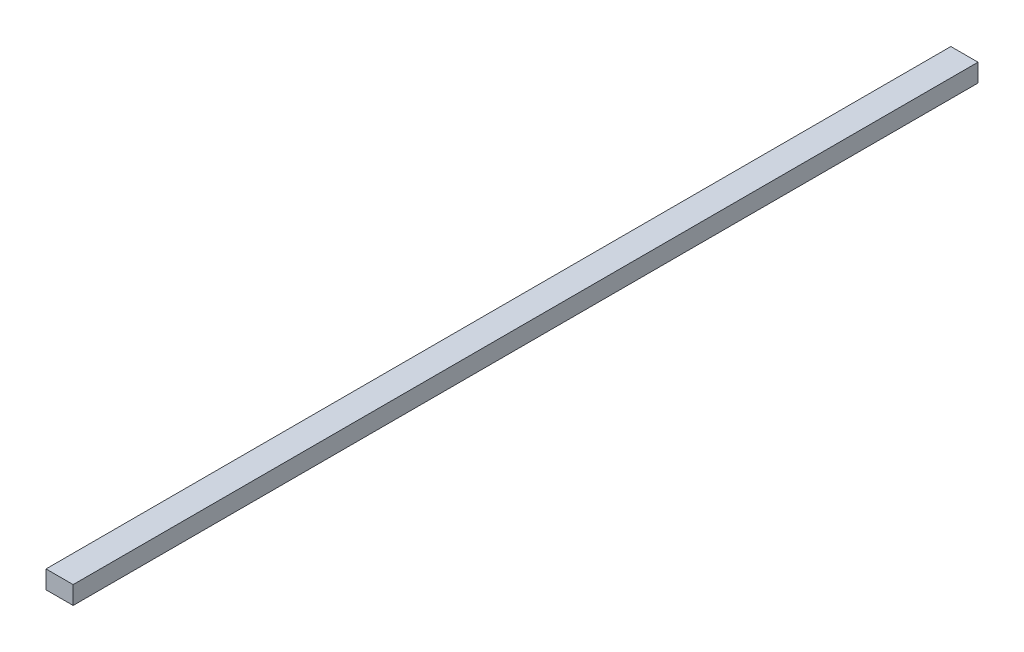
ISO-10303-21;
HEADER;
FILE_DESCRIPTION(('STEP AP214'),'2;1');
FILE_NAME('part.step','',(''),(''),'','','');
FILE_SCHEMA(('AUTOMOTIVE_DESIGN { 1 0 10303 214 1 1 1 1 }'));
ENDSEC;
DATA;
#1=APPLICATION_CONTEXT('core data for automotive mechanical design processes');
#2=APPLICATION_PROTOCOL_DEFINITION('international standard','automotive_design',2000,#1);
#3=PRODUCT_CONTEXT('',#1,'mechanical');
#4=PRODUCT('Part','Part','',(#3));
#5=PRODUCT_RELATED_PRODUCT_CATEGORY('part','',(#4));
#6=PRODUCT_DEFINITION_FORMATION('','',#4);
#7=PRODUCT_DEFINITION_CONTEXT('part definition',#1,'design');
#8=PRODUCT_DEFINITION('design','',#6,#7);
#9=PRODUCT_DEFINITION_SHAPE('','',#8);
#10=(LENGTH_UNIT() NAMED_UNIT(*) SI_UNIT(.MILLI.,.METRE.));
#11=(NAMED_UNIT(*) PLANE_ANGLE_UNIT() SI_UNIT($,.RADIAN.));
#12=(NAMED_UNIT(*) SI_UNIT($,.STERADIAN.) SOLID_ANGLE_UNIT());
#13=UNCERTAINTY_MEASURE_WITH_UNIT(LENGTH_MEASURE(1.E-05),#10,'distance_accuracy_value','');
#14=(GEOMETRIC_REPRESENTATION_CONTEXT(3) GLOBAL_UNCERTAINTY_ASSIGNED_CONTEXT((#13)) GLOBAL_UNIT_ASSIGNED_CONTEXT((#10,
#11,#12)) REPRESENTATION_CONTEXT('',''));
#15=CARTESIAN_POINT('',(0.,0.,0.));
#16=DIRECTION('',(0.,0.,1.));
#17=DIRECTION('',(1.,0.,0.));
#18=AXIS2_PLACEMENT_3D('',#15,#16,#17);
#19=CARTESIAN_POINT('',(0.,8.,0.));
#20=DIRECTION('',(-1.,0.,0.));
#21=DIRECTION('',(0.,0.,1.));
#22=AXIS2_PLACEMENT_3D('',#19,#20,#21);
#23=PLANE('',#22);
#24=DIRECTION('',(0.,0.,-1.));
#25=VECTOR('',#24,1.);
#26=CARTESIAN_POINT('',(0.,0.,0.));
#27=LINE('',#26,#25);
#28=CARTESIAN_POINT('',(0.,0.,0.));
#29=VERTEX_POINT('',#28);
#30=CARTESIAN_POINT('',(0.,0.,-400.));
#31=VERTEX_POINT('',#30);
#32=EDGE_CURVE('E102',#29,#31,#27,.T.);
#33=ORIENTED_EDGE('',*,*,#32,.F.);
#34=DIRECTION('',(0.,-1.,0.));
#35=VECTOR('',#34,1.);
#36=CARTESIAN_POINT('',(0.,8.,0.));
#37=LINE('',#36,#35);
#38=CARTESIAN_POINT('',(0.,8.,0.));
#39=VERTEX_POINT('',#38);
#40=EDGE_CURVE('E11',#39,#29,#37,.T.);
#41=ORIENTED_EDGE('',*,*,#40,.F.);
#42=DIRECTION('',(0.,0.,-1.));
#43=VECTOR('',#42,1.);
#44=CARTESIAN_POINT('',(0.,8.,0.));
#45=LINE('',#44,#43);
#46=CARTESIAN_POINT('',(0.,8.,-400.));
#47=VERTEX_POINT('',#46);
#48=EDGE_CURVE('E97',#39,#47,#45,.T.);
#49=ORIENTED_EDGE('',*,*,#48,.T.);
#50=DIRECTION('',(0.,-1.,0.));
#51=VECTOR('',#50,1.);
#52=CARTESIAN_POINT('',(0.,8.,-400.));
#53=LINE('',#52,#51);
#54=EDGE_CURVE('E40',#47,#31,#53,.T.);
#55=ORIENTED_EDGE('',*,*,#54,.T.);
#56=EDGE_LOOP('',(#33,#41,#49,#55));
#57=FACE_BOUND('',#56,.T.);
#58=ADVANCED_FACE('F37',(#57),#23,.T.);
#59=CARTESIAN_POINT('',(0.,8.,0.));
#60=DIRECTION('',(0.,0.,-1.));
#61=DIRECTION('',(-1.,0.,0.));
#62=AXIS2_PLACEMENT_3D('',#59,#60,#61);
#63=PLANE('',#62);
#64=DIRECTION('',(1.,0.,0.));
#65=VECTOR('',#64,1.);
#66=CARTESIAN_POINT('',(0.,0.,0.));
#67=LINE('',#66,#65);
#68=CARTESIAN_POINT('',(12.,0.,0.));
#69=VERTEX_POINT('',#68);
#70=EDGE_CURVE('E70',#29,#69,#67,.T.);
#71=ORIENTED_EDGE('',*,*,#70,.T.);
#72=DIRECTION('',(0.,-1.,0.));
#73=VECTOR('',#72,1.);
#74=CARTESIAN_POINT('',(12.,8.,0.));
#75=LINE('',#74,#73);
#76=CARTESIAN_POINT('',(12.,8.,0.));
#77=VERTEX_POINT('',#76);
#78=EDGE_CURVE('E46',#77,#69,#75,.T.);
#79=ORIENTED_EDGE('',*,*,#78,.F.);
#80=DIRECTION('',(1.,0.,0.));
#81=VECTOR('',#80,1.);
#82=CARTESIAN_POINT('',(0.,8.,0.));
#83=LINE('',#82,#81);
#84=EDGE_CURVE('E87',#39,#77,#83,.T.);
#85=ORIENTED_EDGE('',*,*,#84,.F.);
#86=ORIENTED_EDGE('',*,*,#40,.T.);
#87=EDGE_LOOP('',(#71,#79,#85,#86));
#88=FACE_BOUND('',#87,.T.);
#89=ADVANCED_FACE('F112',(#88),#63,.F.);
#90=CARTESIAN_POINT('',(12.,8.,0.));
#91=DIRECTION('',(-1.,0.,0.));
#92=DIRECTION('',(0.,0.,1.));
#93=AXIS2_PLACEMENT_3D('',#90,#91,#92);
#94=PLANE('',#93);
#95=DIRECTION('',(0.,0.,-1.));
#96=VECTOR('',#95,1.);
#97=CARTESIAN_POINT('',(12.,0.,0.));
#98=LINE('',#97,#96);
#99=CARTESIAN_POINT('',(12.,0.,-400.));
#100=VERTEX_POINT('',#99);
#101=EDGE_CURVE('E94',#69,#100,#98,.T.);
#102=ORIENTED_EDGE('',*,*,#101,.T.);
#103=DIRECTION('',(0.,-1.,0.));
#104=VECTOR('',#103,1.);
#105=CARTESIAN_POINT('',(12.,8.,-400.));
#106=LINE('',#105,#104);
#107=CARTESIAN_POINT('',(12.,8.,-400.));
#108=VERTEX_POINT('',#107);
#109=EDGE_CURVE('E91',#108,#100,#106,.T.);
#110=ORIENTED_EDGE('',*,*,#109,.F.);
#111=DIRECTION('',(0.,0.,-1.));
#112=VECTOR('',#111,1.);
#113=CARTESIAN_POINT('',(12.,8.,0.));
#114=LINE('',#113,#112);
#115=EDGE_CURVE('E82',#77,#108,#114,.T.);
#116=ORIENTED_EDGE('',*,*,#115,.F.);
#117=ORIENTED_EDGE('',*,*,#78,.T.);
#118=EDGE_LOOP('',(#102,#110,#116,#117));
#119=FACE_BOUND('',#118,.T.);
#120=ADVANCED_FACE('F92',(#119),#94,.F.);
#121=CARTESIAN_POINT('',(0.,8.,-400.));
#122=DIRECTION('',(0.,0.,-1.));
#123=DIRECTION('',(-1.,0.,0.));
#124=AXIS2_PLACEMENT_3D('',#121,#122,#123);
#125=PLANE('',#124);
#126=DIRECTION('',(1.,0.,0.));
#127=VECTOR('',#126,1.);
#128=CARTESIAN_POINT('',(0.,0.,-400.));
#129=LINE('',#128,#127);
#130=EDGE_CURVE('E105',#31,#100,#129,.T.);
#131=ORIENTED_EDGE('',*,*,#130,.F.);
#132=ORIENTED_EDGE('',*,*,#54,.F.);
#133=DIRECTION('',(1.,0.,0.));
#134=VECTOR('',#133,1.);
#135=CARTESIAN_POINT('',(0.,8.,-400.));
#136=LINE('',#135,#134);
#137=EDGE_CURVE('E86',#47,#108,#136,.T.);
#138=ORIENTED_EDGE('',*,*,#137,.T.);
#139=ORIENTED_EDGE('',*,*,#109,.T.);
#140=EDGE_LOOP('',(#131,#132,#138,#139));
#141=FACE_BOUND('',#140,.T.);
#142=ADVANCED_FACE('F96',(#141),#125,.T.);
#143=CARTESIAN_POINT('',(0.,8.,0.));
#144=DIRECTION('',(0.,-1.,0.));
#145=DIRECTION('',(0.,0.,-1.));
#146=AXIS2_PLACEMENT_3D('',#143,#144,#145);
#147=PLANE('',#146);
#148=ORIENTED_EDGE('',*,*,#48,.F.);
#149=ORIENTED_EDGE('',*,*,#84,.T.);
#150=ORIENTED_EDGE('',*,*,#115,.T.);
#151=ORIENTED_EDGE('',*,*,#137,.F.);
#152=EDGE_LOOP('',(#148,#149,#150,#151));
#153=FACE_BOUND('',#152,.T.);
#154=ADVANCED_FACE('F85',(#153),#147,.F.);
#155=CARTESIAN_POINT('',(0.,0.,0.));
#156=DIRECTION('',(0.,-1.,0.));
#157=DIRECTION('',(0.,0.,-1.));
#158=AXIS2_PLACEMENT_3D('',#155,#156,#157);
#159=PLANE('',#158);
#160=ORIENTED_EDGE('',*,*,#32,.T.);
#161=ORIENTED_EDGE('',*,*,#130,.T.);
#162=ORIENTED_EDGE('',*,*,#101,.F.);
#163=ORIENTED_EDGE('',*,*,#70,.F.);
#164=EDGE_LOOP('',(#160,#161,#162,#163));
#165=FACE_BOUND('',#164,.T.);
#166=ADVANCED_FACE('F110',(#165),#159,.T.);
#167=CLOSED_SHELL('',(#58,#89,#120,#142,#154,#166));
#168=MANIFOLD_SOLID_BREP('B2',#167);
#169=ADVANCED_BREP_SHAPE_REPRESENTATION('',(#18,#168),#14);
#170=SHAPE_DEFINITION_REPRESENTATION(#9,#169);
ENDSEC;
END-ISO-10303-21;
